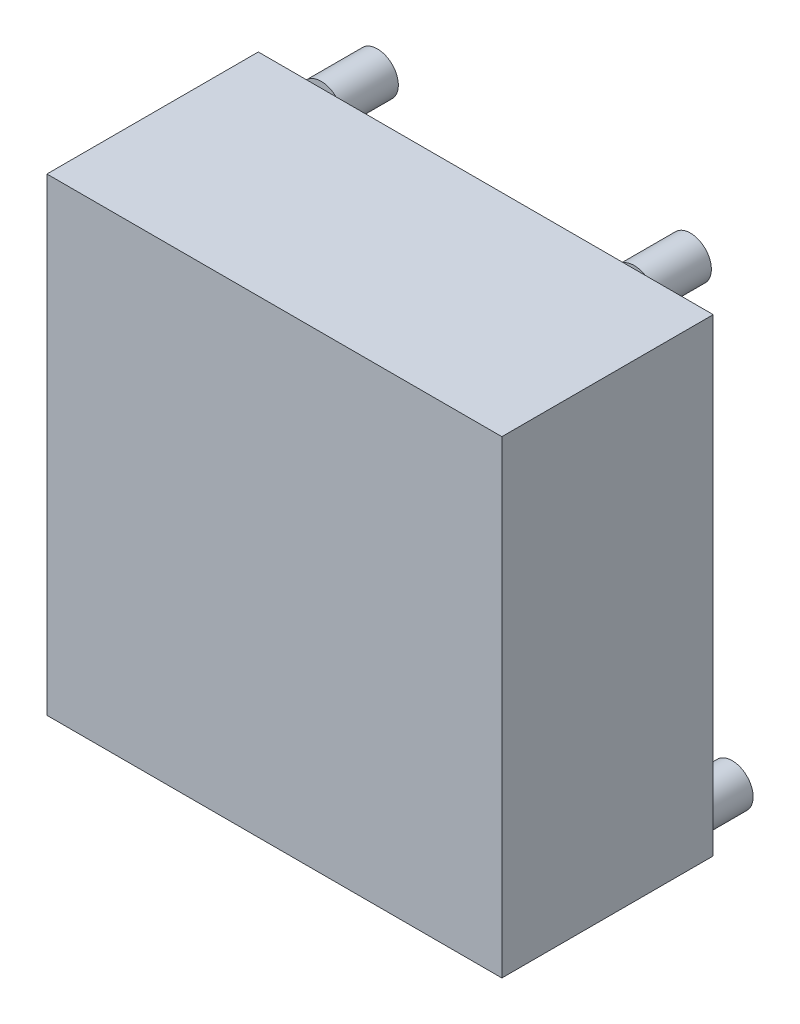
ISO-10303-21;
HEADER;
FILE_DESCRIPTION(('STEP AP214'),'2;1');
FILE_NAME('part.step','',(''),(''),'','','');
FILE_SCHEMA(('AUTOMOTIVE_DESIGN { 1 0 10303 214 1 1 1 1 }'));
ENDSEC;
DATA;
#1=APPLICATION_CONTEXT('core data for automotive mechanical design processes');
#2=APPLICATION_PROTOCOL_DEFINITION('international standard','automotive_design',2000,#1);
#3=PRODUCT_CONTEXT('',#1,'mechanical');
#4=PRODUCT('Part','Part','',(#3));
#5=PRODUCT_RELATED_PRODUCT_CATEGORY('part','',(#4));
#6=PRODUCT_DEFINITION_FORMATION('','',#4);
#7=PRODUCT_DEFINITION_CONTEXT('part definition',#1,'design');
#8=PRODUCT_DEFINITION('design','',#6,#7);
#9=PRODUCT_DEFINITION_SHAPE('','',#8);
#10=(LENGTH_UNIT() NAMED_UNIT(*) SI_UNIT(.MILLI.,.METRE.));
#11=(NAMED_UNIT(*) PLANE_ANGLE_UNIT() SI_UNIT($,.RADIAN.));
#12=(NAMED_UNIT(*) SI_UNIT($,.STERADIAN.) SOLID_ANGLE_UNIT());
#13=UNCERTAINTY_MEASURE_WITH_UNIT(LENGTH_MEASURE(1.E-05),#10,'distance_accuracy_value','');
#14=(GEOMETRIC_REPRESENTATION_CONTEXT(3) GLOBAL_UNCERTAINTY_ASSIGNED_CONTEXT((#13)) GLOBAL_UNIT_ASSIGNED_CONTEXT((#10,
#11,#12)) REPRESENTATION_CONTEXT('',''));
#15=CARTESIAN_POINT('',(0.,0.,0.));
#16=DIRECTION('',(0.,0.,1.));
#17=DIRECTION('',(1.,0.,0.));
#18=AXIS2_PLACEMENT_3D('',#15,#16,#17);
#19=CARTESIAN_POINT('',(0.,0.,0.));
#20=DIRECTION('',(0.,0.,-1.));
#21=DIRECTION('',(-1.,0.,0.));
#22=AXIS2_PLACEMENT_3D('',#19,#20,#21);
#23=PLANE('',#22);
#24=DIRECTION('',(-1.,0.,0.));
#25=VECTOR('',#24,1.);
#26=CARTESIAN_POINT('',(0.,79.883,0.));
#27=LINE('',#26,#25);
#28=CARTESIAN_POINT('',(62.2026438400824,79.883,0.));
#29=VERTEX_POINT('',#28);
#30=CARTESIAN_POINT('',(13.2255947043984,79.883,0.));
#31=VERTEX_POINT('',#30);
#32=EDGE_CURVE('E107',#29,#31,#27,.T.);
#33=ORIENTED_EDGE('',*,*,#32,.F.);
#34=CARTESIAN_POINT('',(64.0588,76.835,0.));
#35=DIRECTION('',(0.,0.,-1.));
#36=DIRECTION('',(-1.,0.,0.));
#37=AXIS2_PLACEMENT_3D('',#34,#35,#36);
#38=CIRCLE('',#37,3.5687);
#39=CARTESIAN_POINT('',(65.9149561599176,79.883,0.));
#40=VERTEX_POINT('',#39);
#41=EDGE_CURVE('E113',#40,#29,#38,.T.);
#42=ORIENTED_EDGE('',*,*,#41,.F.);
#43=CARTESIAN_POINT('',(77.5208,79.883,0.));
#44=VERTEX_POINT('',#43);
#45=EDGE_CURVE('E106',#44,#40,#27,.T.);
#46=ORIENTED_EDGE('',*,*,#45,.F.);
#47=DIRECTION('',(0.,1.,0.));
#48=VECTOR('',#47,1.);
#49=CARTESIAN_POINT('',(77.5208,0.,0.));
#50=LINE('',#49,#48);
#51=CARTESIAN_POINT('',(77.5208,0.,0.));
#52=VERTEX_POINT('',#51);
#53=EDGE_CURVE('E135',#52,#44,#50,.T.);
#54=ORIENTED_EDGE('',*,*,#53,.F.);
#55=DIRECTION('',(1.,0.,0.));
#56=VECTOR('',#55,1.);
#57=CARTESIAN_POINT('',(0.,0.,0.));
#58=LINE('',#57,#56);
#59=CARTESIAN_POINT('',(73.6775947043984,0.,0.));
#60=VERTEX_POINT('',#59);
#61=EDGE_CURVE('E151',#60,#52,#58,.T.);
#62=ORIENTED_EDGE('',*,*,#61,.F.);
#63=CARTESIAN_POINT('',(71.1708,2.54,0.));
#64=DIRECTION('',(0.,0.,-1.));
#65=DIRECTION('',(-1.,0.,0.));
#66=AXIS2_PLACEMENT_3D('',#63,#64,#65);
#67=CIRCLE('',#66,3.5687);
#68=CARTESIAN_POINT('',(68.6640052956016,0.,0.));
#69=VERTEX_POINT('',#68);
#70=EDGE_CURVE('E40',#69,#60,#67,.T.);
#71=ORIENTED_EDGE('',*,*,#70,.F.);
#72=CARTESIAN_POINT('',(5.66586261390612,0.,0.));
#73=VERTEX_POINT('',#72);
#74=EDGE_CURVE('E145',#73,#69,#58,.T.);
#75=ORIENTED_EDGE('',*,*,#74,.F.);
#76=CARTESIAN_POINT('',(3.07339999999999,2.45250021111089,0.));
#77=DIRECTION('',(0.,0.,-1.));
#78=DIRECTION('',(-1.,0.,0.));
#79=AXIS2_PLACEMENT_3D('',#76,#77,#78);
#80=CIRCLE('',#79,3.5687);
#81=CARTESIAN_POINT('',(0.,4.26628965037888,0.));
#82=VERTEX_POINT('',#81);
#83=EDGE_CURVE('E167',#82,#73,#80,.T.);
#84=ORIENTED_EDGE('',*,*,#83,.F.);
#85=DIRECTION('',(0.,-1.,0.));
#86=VECTOR('',#85,1.);
#87=CARTESIAN_POINT('',(0.,0.,0.));
#88=LINE('',#87,#86);
#89=CARTESIAN_POINT('',(0.,79.883,0.));
#90=VERTEX_POINT('',#89);
#91=EDGE_CURVE('E148',#90,#82,#88,.T.);
#92=ORIENTED_EDGE('',*,*,#91,.F.);
#93=CARTESIAN_POINT('',(8.21200529560156,79.883,0.));
#94=VERTEX_POINT('',#93);
#95=EDGE_CURVE('E109',#94,#90,#27,.T.);
#96=ORIENTED_EDGE('',*,*,#95,.F.);
#97=CARTESIAN_POINT('',(10.7188,77.343,0.));
#98=DIRECTION('',(0.,0.,-1.));
#99=DIRECTION('',(-1.,0.,0.));
#100=AXIS2_PLACEMENT_3D('',#97,#98,#99);
#101=CIRCLE('',#100,3.5687);
#102=EDGE_CURVE('E176',#31,#94,#101,.T.);
#103=ORIENTED_EDGE('',*,*,#102,.F.);
#104=EDGE_LOOP('',(#33,#42,#46,#54,#62,#71,#75,#84,#92,#96,#103));
#105=FACE_BOUND('',#104,.T.);
#106=ADVANCED_FACE('F32',(#105),#23,.T.);
#107=CARTESIAN_POINT('',(0.,0.638710771842898,0.));
#108=VERTEX_POINT('',#107);
#109=CARTESIAN_POINT('',(0.,0.,0.));
#110=VERTEX_POINT('',#109);
#111=EDGE_CURVE('E153',#108,#110,#88,.T.);
#112=ORIENTED_EDGE('',*,*,#111,.F.);
#113=CARTESIAN_POINT('',(3.07339999999999,2.45250021111089,0.));
#114=DIRECTION('',(0.,0.,-1.));
#115=DIRECTION('',(-1.,0.,0.));
#116=AXIS2_PLACEMENT_3D('',#113,#114,#115);
#117=CIRCLE('',#116,3.5687);
#118=CARTESIAN_POINT('',(0.480937386093846,0.,0.));
#119=VERTEX_POINT('',#118);
#120=EDGE_CURVE('E11',#108,#119,#117,.F.);
#121=ORIENTED_EDGE('',*,*,#120,.T.);
#122=EDGE_CURVE('E139',#110,#119,#58,.T.);
#123=ORIENTED_EDGE('',*,*,#122,.F.);
#124=EDGE_LOOP('',(#112,#121,#123));
#125=FACE_BOUND('',#124,.T.);
#126=ADVANCED_FACE('F230',(#125),#23,.T.);
#127=CARTESIAN_POINT('',(0.,0.,36.0172));
#128=DIRECTION('',(1.,0.,0.));
#129=DIRECTION('',(0.,1.,0.));
#130=AXIS2_PLACEMENT_3D('',#127,#128,#129);
#131=PLANE('',#130);
#132=ORIENTED_EDGE('',*,*,#91,.T.);
#133=EDGE_CURVE('E152',#82,#108,#88,.T.);
#134=ORIENTED_EDGE('',*,*,#133,.T.);
#135=ORIENTED_EDGE('',*,*,#111,.T.);
#136=DIRECTION('',(0.,0.,-1.));
#137=VECTOR('',#136,1.);
#138=CARTESIAN_POINT('',(0.,0.,36.0172));
#139=LINE('',#138,#137);
#140=CARTESIAN_POINT('',(0.,0.,36.0172));
#141=VERTEX_POINT('',#140);
#142=EDGE_CURVE('E255',#141,#110,#139,.T.);
#143=ORIENTED_EDGE('',*,*,#142,.F.);
#144=DIRECTION('',(0.,-1.,0.));
#145=VECTOR('',#144,1.);
#146=CARTESIAN_POINT('',(0.,0.,36.0172));
#147=LINE('',#146,#145);
#148=CARTESIAN_POINT('',(0.,79.883,36.0172));
#149=VERTEX_POINT('',#148);
#150=EDGE_CURVE('E127',#149,#141,#147,.T.);
#151=ORIENTED_EDGE('',*,*,#150,.F.);
#152=DIRECTION('',(0.,0.,-1.));
#153=VECTOR('',#152,1.);
#154=CARTESIAN_POINT('',(0.,79.883,36.0172));
#155=LINE('',#154,#153);
#156=EDGE_CURVE('E156',#149,#90,#155,.T.);
#157=ORIENTED_EDGE('',*,*,#156,.T.);
#158=EDGE_LOOP('',(#132,#134,#135,#143,#151,#157));
#159=FACE_BOUND('',#158,.T.);
#160=ADVANCED_FACE('F34',(#159),#131,.F.);
#161=CARTESIAN_POINT('',(0.,0.,36.0172));
#162=DIRECTION('',(0.,1.,0.));
#163=DIRECTION('',(0.,0.,1.));
#164=AXIS2_PLACEMENT_3D('',#161,#162,#163);
#165=PLANE('',#164);
#166=ORIENTED_EDGE('',*,*,#122,.T.);
#167=EDGE_CURVE('E143',#119,#73,#58,.T.);
#168=ORIENTED_EDGE('',*,*,#167,.T.);
#169=ORIENTED_EDGE('',*,*,#74,.T.);
#170=EDGE_CURVE('E146',#69,#60,#58,.T.);
#171=ORIENTED_EDGE('',*,*,#170,.T.);
#172=ORIENTED_EDGE('',*,*,#61,.T.);
#173=DIRECTION('',(0.,0.,-1.));
#174=VECTOR('',#173,1.);
#175=CARTESIAN_POINT('',(77.5208,0.,36.0172));
#176=LINE('',#175,#174);
#177=CARTESIAN_POINT('',(77.5208,0.,36.0172));
#178=VERTEX_POINT('',#177);
#179=EDGE_CURVE('E301',#178,#52,#176,.T.);
#180=ORIENTED_EDGE('',*,*,#179,.F.);
#181=DIRECTION('',(1.,0.,0.));
#182=VECTOR('',#181,1.);
#183=CARTESIAN_POINT('',(0.,0.,36.0172));
#184=LINE('',#183,#182);
#185=EDGE_CURVE('E130',#141,#178,#184,.T.);
#186=ORIENTED_EDGE('',*,*,#185,.F.);
#187=ORIENTED_EDGE('',*,*,#142,.T.);
#188=EDGE_LOOP('',(#166,#168,#169,#171,#172,#180,#186,#187));
#189=FACE_BOUND('',#188,.T.);
#190=ADVANCED_FACE('F244',(#189),#165,.F.);
#191=CARTESIAN_POINT('',(77.5208,0.,36.0172));
#192=DIRECTION('',(-1.,0.,0.));
#193=DIRECTION('',(0.,-1.,0.));
#194=AXIS2_PLACEMENT_3D('',#191,#192,#193);
#195=PLANE('',#194);
#196=ORIENTED_EDGE('',*,*,#53,.T.);
#197=DIRECTION('',(0.,0.,-1.));
#198=VECTOR('',#197,1.);
#199=CARTESIAN_POINT('',(77.5208,79.883,36.0172));
#200=LINE('',#199,#198);
#201=CARTESIAN_POINT('',(77.5208,79.883,36.0172));
#202=VERTEX_POINT('',#201);
#203=EDGE_CURVE('E126',#202,#44,#200,.T.);
#204=ORIENTED_EDGE('',*,*,#203,.F.);
#205=DIRECTION('',(0.,1.,0.));
#206=VECTOR('',#205,1.);
#207=CARTESIAN_POINT('',(77.5208,0.,36.0172));
#208=LINE('',#207,#206);
#209=EDGE_CURVE('E157',#178,#202,#208,.T.);
#210=ORIENTED_EDGE('',*,*,#209,.F.);
#211=ORIENTED_EDGE('',*,*,#179,.T.);
#212=EDGE_LOOP('',(#196,#204,#210,#211));
#213=FACE_BOUND('',#212,.T.);
#214=ADVANCED_FACE('F242',(#213),#195,.F.);
#215=CARTESIAN_POINT('',(0.,79.883,36.0172));
#216=DIRECTION('',(0.,-1.,0.));
#217=DIRECTION('',(0.,0.,-1.));
#218=AXIS2_PLACEMENT_3D('',#215,#216,#217);
#219=PLANE('',#218);
#220=ORIENTED_EDGE('',*,*,#45,.T.);
#221=EDGE_CURVE('E102',#40,#29,#27,.T.);
#222=ORIENTED_EDGE('',*,*,#221,.T.);
#223=ORIENTED_EDGE('',*,*,#32,.T.);
#224=EDGE_CURVE('E128',#31,#94,#27,.T.);
#225=ORIENTED_EDGE('',*,*,#224,.T.);
#226=ORIENTED_EDGE('',*,*,#95,.T.);
#227=ORIENTED_EDGE('',*,*,#156,.F.);
#228=DIRECTION('',(-1.,0.,0.));
#229=VECTOR('',#228,1.);
#230=CARTESIAN_POINT('',(0.,79.883,36.0172));
#231=LINE('',#230,#229);
#232=EDGE_CURVE('E154',#202,#149,#231,.T.);
#233=ORIENTED_EDGE('',*,*,#232,.F.);
#234=ORIENTED_EDGE('',*,*,#203,.T.);
#235=EDGE_LOOP('',(#220,#222,#223,#225,#226,#227,#233,#234));
#236=FACE_BOUND('',#235,.T.);
#237=ADVANCED_FACE('F123',(#236),#219,.F.);
#238=CARTESIAN_POINT('',(0.,0.,36.0172));
#239=DIRECTION('',(0.,0.,-1.));
#240=DIRECTION('',(-1.,0.,0.));
#241=AXIS2_PLACEMENT_3D('',#238,#239,#240);
#242=PLANE('',#241);
#243=ORIENTED_EDGE('',*,*,#150,.T.);
#244=ORIENTED_EDGE('',*,*,#185,.T.);
#245=ORIENTED_EDGE('',*,*,#209,.T.);
#246=ORIENTED_EDGE('',*,*,#232,.T.);
#247=EDGE_LOOP('',(#243,#244,#245,#246));
#248=FACE_BOUND('',#247,.T.);
#249=ADVANCED_FACE('F238',(#248),#242,.F.);
#250=CARTESIAN_POINT('',(71.1708,2.54,-9.5758));
#251=DIRECTION('',(0.,0.,1.));
#252=DIRECTION('',(1.,0.,0.));
#253=AXIS2_PLACEMENT_3D('',#250,#251,#252);
#254=CYLINDRICAL_SURFACE('',#253,3.5687);
#255=CARTESIAN_POINT('',(71.1708,2.54,-9.5758));
#256=DIRECTION('',(0.,0.,-1.));
#257=DIRECTION('',(-1.,0.,0.));
#258=AXIS2_PLACEMENT_3D('',#255,#256,#257);
#259=CIRCLE('',#258,3.5687);
#260=CARTESIAN_POINT('',(67.6021,2.54,-9.5758));
#261=VERTEX_POINT('',#260);
#262=EDGE_CURVE('E163',#261,#261,#259,.T.);
#263=ORIENTED_EDGE('',*,*,#262,.F.);
#264=EDGE_LOOP('',(#263));
#265=FACE_BOUND('',#264,.T.);
#266=EDGE_CURVE('E160',#60,#69,#67,.T.);
#267=ORIENTED_EDGE('',*,*,#266,.T.);
#268=ORIENTED_EDGE('',*,*,#70,.T.);
#269=EDGE_LOOP('',(#267,#268));
#270=FACE_BOUND('',#269,.T.);
#271=ADVANCED_FACE('F275',(#265,#270),#254,.T.);
#272=CARTESIAN_POINT('',(71.1708,2.54,-9.5758));
#273=DIRECTION('',(0.,0.,-1.));
#274=DIRECTION('',(-1.,0.,0.));
#275=AXIS2_PLACEMENT_3D('',#272,#273,#274);
#276=PLANE('',#275);
#277=CARTESIAN_POINT('',(71.1708,2.54,-9.5758));
#278=DIRECTION('',(0.,0.,-1.));
#279=DIRECTION('',(-1.,0.,0.));
#280=AXIS2_PLACEMENT_3D('',#277,#278,#279);
#281=CIRCLE('',#280,1.3462);
#282=CARTESIAN_POINT('',(69.8246,2.54,-9.5758));
#283=VERTEX_POINT('',#282);
#284=EDGE_CURVE('E187',#283,#283,#281,.T.);
#285=ORIENTED_EDGE('',*,*,#284,.F.);
#286=EDGE_LOOP('',(#285));
#287=FACE_BOUND('',#286,.T.);
#288=ORIENTED_EDGE('',*,*,#262,.T.);
#289=EDGE_LOOP('',(#288));
#290=FACE_BOUND('',#289,.T.);
#291=ADVANCED_FACE('F279',(#287,#290),#276,.T.);
#292=CARTESIAN_POINT('',(71.1708,2.54,0.));
#293=DIRECTION('',(0.,0.,-1.));
#294=DIRECTION('',(-1.,0.,0.));
#295=AXIS2_PLACEMENT_3D('',#292,#293,#294);
#296=PLANE('',#295);
#297=ORIENTED_EDGE('',*,*,#170,.F.);
#298=ORIENTED_EDGE('',*,*,#266,.F.);
#299=EDGE_LOOP('',(#297,#298));
#300=FACE_BOUND('',#299,.T.);
#301=ADVANCED_FACE('F276',(#300),#296,.F.);
#302=CARTESIAN_POINT('',(3.07339999999999,2.45250021111089,0.));
#303=DIRECTION('',(0.,0.,-1.));
#304=DIRECTION('',(-1.,0.,0.));
#305=AXIS2_PLACEMENT_3D('',#302,#303,#304);
#306=PLANE('',#305);
#307=EDGE_CURVE('E171',#108,#82,#80,.T.);
#308=ORIENTED_EDGE('',*,*,#307,.F.);
#309=ORIENTED_EDGE('',*,*,#133,.F.);
#310=EDGE_LOOP('',(#308,#309));
#311=FACE_BOUND('',#310,.T.);
#312=ADVANCED_FACE('F278',(#311),#306,.F.);
#313=EDGE_CURVE('E170',#73,#119,#80,.T.);
#314=ORIENTED_EDGE('',*,*,#313,.F.);
#315=ORIENTED_EDGE('',*,*,#167,.F.);
#316=EDGE_LOOP('',(#314,#315));
#317=FACE_BOUND('',#316,.T.);
#318=ADVANCED_FACE('F266',(#317),#306,.F.);
#319=CARTESIAN_POINT('',(3.07339999999999,2.45250021111089,-9.5758));
#320=DIRECTION('',(0.,0.,1.));
#321=DIRECTION('',(1.,0.,0.));
#322=AXIS2_PLACEMENT_3D('',#319,#320,#321);
#323=CYLINDRICAL_SURFACE('',#322,3.5687);
#324=CARTESIAN_POINT('',(3.07339999999999,2.45250021111089,-9.5758));
#325=DIRECTION('',(0.,0.,-1.));
#326=DIRECTION('',(-1.,0.,0.));
#327=AXIS2_PLACEMENT_3D('',#324,#325,#326);
#328=CIRCLE('',#327,3.5687);
#329=CARTESIAN_POINT('',(-0.495300000000015,2.45250021111089,-9.5758));
#330=VERTEX_POINT('',#329);
#331=EDGE_CURVE('E164',#330,#330,#328,.T.);
#332=ORIENTED_EDGE('',*,*,#331,.F.);
#333=EDGE_LOOP('',(#332));
#334=FACE_BOUND('',#333,.T.);
#335=ORIENTED_EDGE('',*,*,#83,.T.);
#336=ORIENTED_EDGE('',*,*,#313,.T.);
#337=ORIENTED_EDGE('',*,*,#120,.F.);
#338=ORIENTED_EDGE('',*,*,#307,.T.);
#339=EDGE_LOOP('',(#335,#336,#337,#338));
#340=FACE_BOUND('',#339,.T.);
#341=ADVANCED_FACE('F261',(#334,#340),#323,.T.);
#342=CARTESIAN_POINT('',(3.07339999999999,2.45250021111089,-9.5758));
#343=DIRECTION('',(0.,0.,-1.));
#344=DIRECTION('',(-1.,0.,0.));
#345=AXIS2_PLACEMENT_3D('',#342,#343,#344);
#346=PLANE('',#345);
#347=CARTESIAN_POINT('',(3.07339999999999,2.45250021111089,-9.5758));
#348=DIRECTION('',(0.,0.,-1.));
#349=DIRECTION('',(-1.,0.,0.));
#350=AXIS2_PLACEMENT_3D('',#347,#348,#349);
#351=CIRCLE('',#350,1.3462);
#352=CARTESIAN_POINT('',(1.72719999999999,2.45250021111089,-9.5758));
#353=VERTEX_POINT('',#352);
#354=EDGE_CURVE('E181',#353,#353,#351,.T.);
#355=ORIENTED_EDGE('',*,*,#354,.F.);
#356=EDGE_LOOP('',(#355));
#357=FACE_BOUND('',#356,.T.);
#358=ORIENTED_EDGE('',*,*,#331,.T.);
#359=EDGE_LOOP('',(#358));
#360=FACE_BOUND('',#359,.T.);
#361=ADVANCED_FACE('F316',(#357,#360),#346,.T.);
#362=CARTESIAN_POINT('',(10.7188,77.343,0.));
#363=DIRECTION('',(0.,0.,-1.));
#364=DIRECTION('',(-1.,0.,0.));
#365=AXIS2_PLACEMENT_3D('',#362,#363,#364);
#366=PLANE('',#365);
#367=EDGE_CURVE('E53',#94,#31,#101,.T.);
#368=ORIENTED_EDGE('',*,*,#367,.F.);
#369=ORIENTED_EDGE('',*,*,#224,.F.);
#370=EDGE_LOOP('',(#368,#369));
#371=FACE_BOUND('',#370,.T.);
#372=ADVANCED_FACE('F308',(#371),#366,.F.);
#373=CARTESIAN_POINT('',(10.7188,77.343,-9.5758));
#374=DIRECTION('',(0.,0.,1.));
#375=DIRECTION('',(1.,0.,0.));
#376=AXIS2_PLACEMENT_3D('',#373,#374,#375);
#377=CYLINDRICAL_SURFACE('',#376,3.5687);
#378=CARTESIAN_POINT('',(10.7188,77.343,-9.5758));
#379=DIRECTION('',(0.,0.,-1.));
#380=DIRECTION('',(-1.,0.,0.));
#381=AXIS2_PLACEMENT_3D('',#378,#379,#380);
#382=CIRCLE('',#381,3.5687);
#383=CARTESIAN_POINT('',(7.15009999999998,77.343,-9.5758));
#384=VERTEX_POINT('',#383);
#385=EDGE_CURVE('E175',#384,#384,#382,.T.);
#386=ORIENTED_EDGE('',*,*,#385,.F.);
#387=EDGE_LOOP('',(#386));
#388=FACE_BOUND('',#387,.T.);
#389=ORIENTED_EDGE('',*,*,#367,.T.);
#390=ORIENTED_EDGE('',*,*,#102,.T.);
#391=EDGE_LOOP('',(#389,#390));
#392=FACE_BOUND('',#391,.T.);
#393=ADVANCED_FACE('F306',(#388,#392),#377,.T.);
#394=CARTESIAN_POINT('',(10.7188,77.343,-9.5758));
#395=DIRECTION('',(0.,0.,-1.));
#396=DIRECTION('',(-1.,0.,0.));
#397=AXIS2_PLACEMENT_3D('',#394,#395,#396);
#398=PLANE('',#397);
#399=CARTESIAN_POINT('',(10.7188,77.343,-9.5758));
#400=DIRECTION('',(0.,0.,-1.));
#401=DIRECTION('',(-1.,0.,0.));
#402=AXIS2_PLACEMENT_3D('',#399,#400,#401);
#403=CIRCLE('',#402,1.3462);
#404=CARTESIAN_POINT('',(9.37259999999998,77.343,-9.5758));
#405=VERTEX_POINT('',#404);
#406=EDGE_CURVE('E193',#405,#405,#403,.T.);
#407=ORIENTED_EDGE('',*,*,#406,.F.);
#408=EDGE_LOOP('',(#407));
#409=FACE_BOUND('',#408,.T.);
#410=ORIENTED_EDGE('',*,*,#385,.T.);
#411=EDGE_LOOP('',(#410));
#412=FACE_BOUND('',#411,.T.);
#413=ADVANCED_FACE('F226',(#409,#412),#398,.T.);
#414=CARTESIAN_POINT('',(64.0588,76.835,0.));
#415=DIRECTION('',(0.,0.,-1.));
#416=DIRECTION('',(-1.,0.,0.));
#417=AXIS2_PLACEMENT_3D('',#414,#415,#416);
#418=PLANE('',#417);
#419=EDGE_CURVE('E46',#29,#40,#38,.T.);
#420=ORIENTED_EDGE('',*,*,#419,.F.);
#421=ORIENTED_EDGE('',*,*,#221,.F.);
#422=EDGE_LOOP('',(#420,#421));
#423=FACE_BOUND('',#422,.T.);
#424=ADVANCED_FACE('F103',(#423),#418,.F.);
#425=CARTESIAN_POINT('',(64.0588,76.835,-9.5758));
#426=DIRECTION('',(0.,0.,1.));
#427=DIRECTION('',(1.,0.,0.));
#428=AXIS2_PLACEMENT_3D('',#425,#426,#427);
#429=CYLINDRICAL_SURFACE('',#428,3.5687);
#430=CARTESIAN_POINT('',(64.0588,76.835,-9.5758));
#431=DIRECTION('',(0.,0.,-1.));
#432=DIRECTION('',(-1.,0.,0.));
#433=AXIS2_PLACEMENT_3D('',#430,#431,#432);
#434=CIRCLE('',#433,3.5687);
#435=CARTESIAN_POINT('',(60.4901,76.835,-9.5758));
#436=VERTEX_POINT('',#435);
#437=EDGE_CURVE('E115',#436,#436,#434,.T.);
#438=ORIENTED_EDGE('',*,*,#437,.F.);
#439=EDGE_LOOP('',(#438));
#440=FACE_BOUND('',#439,.T.);
#441=ORIENTED_EDGE('',*,*,#419,.T.);
#442=ORIENTED_EDGE('',*,*,#41,.T.);
#443=EDGE_LOOP('',(#441,#442));
#444=FACE_BOUND('',#443,.T.);
#445=ADVANCED_FACE('F112',(#440,#444),#429,.T.);
#446=CARTESIAN_POINT('',(64.0588,76.835,-9.5758));
#447=DIRECTION('',(0.,0.,-1.));
#448=DIRECTION('',(-1.,0.,0.));
#449=AXIS2_PLACEMENT_3D('',#446,#447,#448);
#450=PLANE('',#449);
#451=CARTESIAN_POINT('',(64.0588,76.835,-9.5758));
#452=DIRECTION('',(0.,0.,-1.));
#453=DIRECTION('',(-1.,0.,0.));
#454=AXIS2_PLACEMENT_3D('',#451,#452,#453);
#455=CIRCLE('',#454,1.3462);
#456=CARTESIAN_POINT('',(62.7126,76.835,-9.5758));
#457=VERTEX_POINT('',#456);
#458=EDGE_CURVE('E199',#457,#457,#455,.T.);
#459=ORIENTED_EDGE('',*,*,#458,.F.);
#460=EDGE_LOOP('',(#459));
#461=FACE_BOUND('',#460,.T.);
#462=ORIENTED_EDGE('',*,*,#437,.T.);
#463=EDGE_LOOP('',(#462));
#464=FACE_BOUND('',#463,.T.);
#465=ADVANCED_FACE('F214',(#461,#464),#450,.T.);
#466=CARTESIAN_POINT('',(3.07339999999999,2.45250021111089,-0.939800000000001));
#467=DIRECTION('',(0.,0.,-1.));
#468=DIRECTION('',(-1.,0.,0.));
#469=AXIS2_PLACEMENT_3D('',#466,#467,#468);
#470=CYLINDRICAL_SURFACE('',#469,1.3462);
#471=CARTESIAN_POINT('',(3.07339999999999,2.45250021111089,-0.939800000000001));
#472=DIRECTION('',(0.,0.,-1.));
#473=DIRECTION('',(-1.,0.,0.));
#474=AXIS2_PLACEMENT_3D('',#471,#472,#473);
#475=CIRCLE('',#474,1.3462);
#476=CARTESIAN_POINT('',(1.72719999999999,2.45250021111089,-0.939800000000001));
#477=VERTEX_POINT('',#476);
#478=EDGE_CURVE('E121',#477,#477,#475,.T.);
#479=ORIENTED_EDGE('',*,*,#478,.F.);
#480=EDGE_LOOP('',(#479));
#481=FACE_BOUND('',#480,.T.);
#482=ORIENTED_EDGE('',*,*,#354,.T.);
#483=EDGE_LOOP('',(#482));
#484=FACE_BOUND('',#483,.T.);
#485=ADVANCED_FACE('F217',(#481,#484),#470,.F.);
#486=CARTESIAN_POINT('',(3.07339999999999,2.45250021111089,-0.939800000000001));
#487=DIRECTION('',(0.,0.,-1.));
#488=DIRECTION('',(-1.,0.,0.));
#489=AXIS2_PLACEMENT_3D('',#486,#487,#488);
#490=PLANE('',#489);
#491=ORIENTED_EDGE('',*,*,#478,.T.);
#492=EDGE_LOOP('',(#491));
#493=FACE_BOUND('',#492,.T.);
#494=ADVANCED_FACE('F431',(#493),#490,.T.);
#495=CARTESIAN_POINT('',(71.1708,2.54,-0.939800000000001));
#496=DIRECTION('',(0.,0.,-1.));
#497=DIRECTION('',(-1.,0.,0.));
#498=AXIS2_PLACEMENT_3D('',#495,#496,#497);
#499=CYLINDRICAL_SURFACE('',#498,1.3462);
#500=CARTESIAN_POINT('',(71.1708,2.54,-0.939800000000001));
#501=DIRECTION('',(0.,0.,-1.));
#502=DIRECTION('',(-1.,0.,0.));
#503=AXIS2_PLACEMENT_3D('',#500,#501,#502);
#504=CIRCLE('',#503,1.3462);
#505=CARTESIAN_POINT('',(69.8246,2.54,-0.939800000000001));
#506=VERTEX_POINT('',#505);
#507=EDGE_CURVE('E184',#506,#506,#504,.T.);
#508=ORIENTED_EDGE('',*,*,#507,.F.);
#509=EDGE_LOOP('',(#508));
#510=FACE_BOUND('',#509,.T.);
#511=ORIENTED_EDGE('',*,*,#284,.T.);
#512=EDGE_LOOP('',(#511));
#513=FACE_BOUND('',#512,.T.);
#514=ADVANCED_FACE('F441',(#510,#513),#499,.F.);
#515=CARTESIAN_POINT('',(71.1708,2.54,-0.939800000000001));
#516=DIRECTION('',(0.,0.,-1.));
#517=DIRECTION('',(-1.,0.,0.));
#518=AXIS2_PLACEMENT_3D('',#515,#516,#517);
#519=PLANE('',#518);
#520=ORIENTED_EDGE('',*,*,#507,.T.);
#521=EDGE_LOOP('',(#520));
#522=FACE_BOUND('',#521,.T.);
#523=ADVANCED_FACE('F451',(#522),#519,.T.);
#524=CARTESIAN_POINT('',(10.7188,77.343,-0.939800000000001));
#525=DIRECTION('',(0.,0.,-1.));
#526=DIRECTION('',(-1.,0.,0.));
#527=AXIS2_PLACEMENT_3D('',#524,#525,#526);
#528=CYLINDRICAL_SURFACE('',#527,1.3462);
#529=CARTESIAN_POINT('',(10.7188,77.343,-0.939800000000001));
#530=DIRECTION('',(0.,0.,-1.));
#531=DIRECTION('',(-1.,0.,0.));
#532=AXIS2_PLACEMENT_3D('',#529,#530,#531);
#533=CIRCLE('',#532,1.3462);
#534=CARTESIAN_POINT('',(9.37259999999998,77.343,-0.939800000000001));
#535=VERTEX_POINT('',#534);
#536=EDGE_CURVE('E190',#535,#535,#533,.T.);
#537=ORIENTED_EDGE('',*,*,#536,.F.);
#538=EDGE_LOOP('',(#537));
#539=FACE_BOUND('',#538,.T.);
#540=ORIENTED_EDGE('',*,*,#406,.T.);
#541=EDGE_LOOP('',(#540));
#542=FACE_BOUND('',#541,.T.);
#543=ADVANCED_FACE('F461',(#539,#542),#528,.F.);
#544=CARTESIAN_POINT('',(10.7188,77.343,-0.939800000000001));
#545=DIRECTION('',(0.,0.,-1.));
#546=DIRECTION('',(-1.,0.,0.));
#547=AXIS2_PLACEMENT_3D('',#544,#545,#546);
#548=PLANE('',#547);
#549=ORIENTED_EDGE('',*,*,#536,.T.);
#550=EDGE_LOOP('',(#549));
#551=FACE_BOUND('',#550,.T.);
#552=ADVANCED_FACE('F210',(#551),#548,.T.);
#553=CARTESIAN_POINT('',(64.0588,76.835,-0.939800000000001));
#554=DIRECTION('',(0.,0.,-1.));
#555=DIRECTION('',(-1.,0.,0.));
#556=AXIS2_PLACEMENT_3D('',#553,#554,#555);
#557=CYLINDRICAL_SURFACE('',#556,1.3462);
#558=CARTESIAN_POINT('',(64.0588,76.835,-0.939800000000001));
#559=DIRECTION('',(0.,0.,-1.));
#560=DIRECTION('',(-1.,0.,0.));
#561=AXIS2_PLACEMENT_3D('',#558,#559,#560);
#562=CIRCLE('',#561,1.3462);
#563=CARTESIAN_POINT('',(62.7126,76.835,-0.939800000000001));
#564=VERTEX_POINT('',#563);
#565=EDGE_CURVE('E196',#564,#564,#562,.T.);
#566=ORIENTED_EDGE('',*,*,#565,.F.);
#567=EDGE_LOOP('',(#566));
#568=FACE_BOUND('',#567,.T.);
#569=ORIENTED_EDGE('',*,*,#458,.T.);
#570=EDGE_LOOP('',(#569));
#571=FACE_BOUND('',#570,.T.);
#572=ADVANCED_FACE('F207',(#568,#571),#557,.F.);
#573=CARTESIAN_POINT('',(64.0588,76.835,-0.939800000000001));
#574=DIRECTION('',(0.,0.,-1.));
#575=DIRECTION('',(-1.,0.,0.));
#576=AXIS2_PLACEMENT_3D('',#573,#574,#575);
#577=PLANE('',#576);
#578=ORIENTED_EDGE('',*,*,#565,.T.);
#579=EDGE_LOOP('',(#578));
#580=FACE_BOUND('',#579,.T.);
#581=ADVANCED_FACE('F205',(#580),#577,.T.);
#582=CLOSED_SHELL('',(#106,#126,#160,#190,#214,#237,#249,#271,#291,#301,#312,#318,#341,#361,
#372,#393,#413,#424,#445,#465,#485,#494,#514,#523,#543,#552,#572,#581));
#583=MANIFOLD_SOLID_BREP('B2',#582);
#584=ADVANCED_BREP_SHAPE_REPRESENTATION('',(#18,#583),#14);
#585=SHAPE_DEFINITION_REPRESENTATION(#9,#584);
ENDSEC;
END-ISO-10303-21;
